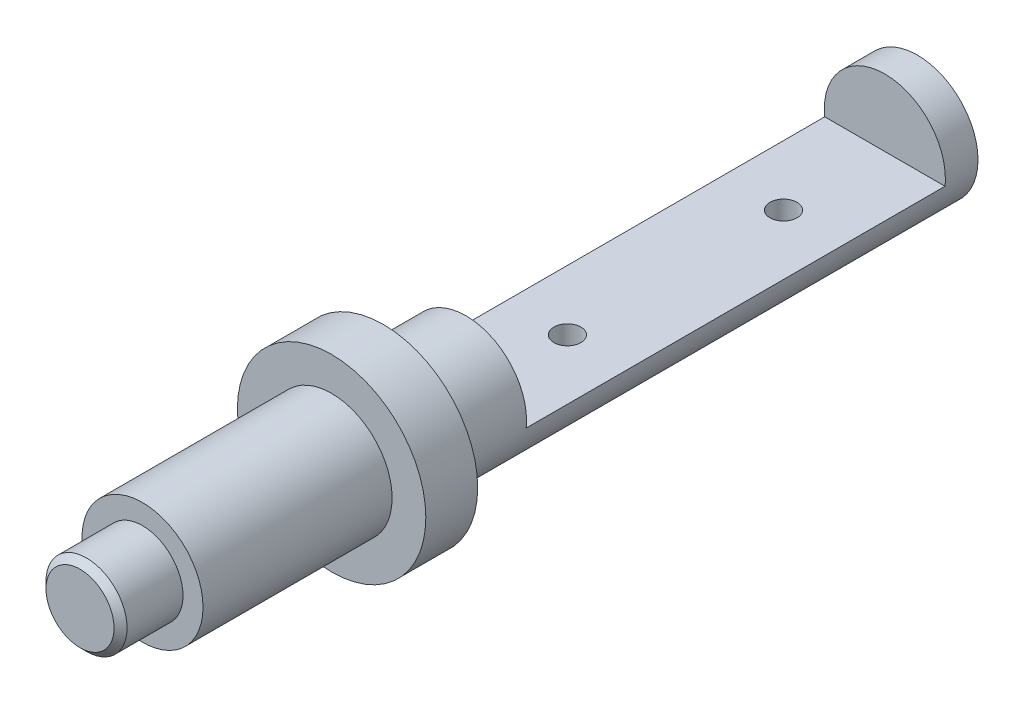
ISO-10303-21;
HEADER;
FILE_DESCRIPTION(('STEP AP214'),'2;1');
FILE_NAME('part.step','',(''),(''),'','','');
FILE_SCHEMA(('AUTOMOTIVE_DESIGN { 1 0 10303 214 1 1 1 1 }'));
ENDSEC;
DATA;
#1=APPLICATION_CONTEXT('core data for automotive mechanical design processes');
#2=APPLICATION_PROTOCOL_DEFINITION('international standard','automotive_design',2000,#1);
#3=PRODUCT_CONTEXT('',#1,'mechanical');
#4=PRODUCT('Part','Part','',(#3));
#5=PRODUCT_RELATED_PRODUCT_CATEGORY('part','',(#4));
#6=PRODUCT_DEFINITION_FORMATION('','',#4);
#7=PRODUCT_DEFINITION_CONTEXT('part definition',#1,'design');
#8=PRODUCT_DEFINITION('design','',#6,#7);
#9=PRODUCT_DEFINITION_SHAPE('','',#8);
#10=(LENGTH_UNIT() NAMED_UNIT(*) SI_UNIT(.MILLI.,.METRE.));
#11=(NAMED_UNIT(*) PLANE_ANGLE_UNIT() SI_UNIT($,.RADIAN.));
#12=(NAMED_UNIT(*) SI_UNIT($,.STERADIAN.) SOLID_ANGLE_UNIT());
#13=UNCERTAINTY_MEASURE_WITH_UNIT(LENGTH_MEASURE(1.E-05),#10,'distance_accuracy_value','');
#14=(GEOMETRIC_REPRESENTATION_CONTEXT(3) GLOBAL_UNCERTAINTY_ASSIGNED_CONTEXT((#13)) GLOBAL_UNIT_ASSIGNED_CONTEXT((#10,
#11,#12)) REPRESENTATION_CONTEXT('',''));
#15=CARTESIAN_POINT('',(0.,0.,0.));
#16=DIRECTION('',(0.,0.,1.));
#17=DIRECTION('',(1.,0.,0.));
#18=AXIS2_PLACEMENT_3D('',#15,#16,#17);
#19=CARTESIAN_POINT('',(5.55111512312578E-13,1.33226762955019E-12,-192.6));
#20=DIRECTION('',(0.,0.,1.));
#21=DIRECTION('',(1.00000000000001,0.,0.));
#22=AXIS2_PLACEMENT_3D('',#19,#20,#21);
#23=PLANE('',#22);
#24=CARTESIAN_POINT('',(5.55111512312578E-13,1.33226762955019E-12,-192.6));
#25=DIRECTION('',(0.,0.,1.));
#26=DIRECTION('',(1.00000000000001,0.,0.));
#27=AXIS2_PLACEMENT_3D('',#24,#25,#26);
#28=CIRCLE('',#27,28.);
#29=CARTESIAN_POINT('',(28.0000000000007,1.32915900508124E-12,-192.6));
#30=VERTEX_POINT('',#29);
#31=EDGE_CURVE('E601',#30,#30,#28,.T.);
#32=ORIENTED_EDGE('',*,*,#31,.F.);
#33=EDGE_LOOP('',(#32));
#34=FACE_BOUND('',#33,.T.);
#35=ADVANCED_FACE('F547',(#34),#23,.F.);
#36=CARTESIAN_POINT('',(7.7715611723761E-13,1.99840144432528E-12,76.3671457905544));
#37=DIRECTION('',(0.,0.,1.));
#38=DIRECTION('',(1.00000000000001,0.,0.));
#39=AXIS2_PLACEMENT_3D('',#36,#37,#38);
#40=CYLINDRICAL_SURFACE('',#39,28.);
#41=CARTESIAN_POINT('',(1.22124532708767E-12,-27.9999999999985,-24.3499999999999));
#42=CARTESIAN_POINT('',(0.173287733267454,-28.0000023074893,-24.3499958426639));
#43=CARTESIAN_POINT('',(0.346526436477157,-27.9983887060969,-24.3572084023678));
#44=CARTESIAN_POINT('',(0.691798529481551,-27.991984406191,-24.3859909947734));
#45=CARTESIAN_POINT('',(0.863831740794679,-27.9871932468583,-24.4075631099433));
#46=CARTESIAN_POINT('',(1.20546852164505,-27.9745615189492,-24.4649068683229));
#47=CARTESIAN_POINT('',(1.3750710244382,-27.9667196516067,-24.5006845593513));
#48=CARTESIAN_POINT('',(1.71063801646085,-27.9482014313855,-24.5861655729498));
#49=CARTESIAN_POINT('',(1.87660114262785,-27.937524035497,-24.6358740201285));
#50=CARTESIAN_POINT('',(2.20342803103323,-27.9136475008783,-24.7487393166743));
#51=CARTESIAN_POINT('',(2.36429886090368,-27.9004520535596,-24.8118764951322));
#52=CARTESIAN_POINT('',(2.68016000285815,-27.8718836943499,-24.9511905778944));
#53=CARTESIAN_POINT('',(2.8351481194758,-27.8565099794519,-25.0273722931678));
#54=CARTESIAN_POINT('',(3.13808852917903,-27.824011246058,-25.1921703418689));
#55=CARTESIAN_POINT('',(3.28604367387584,-27.8068869463878,-25.2807815770004));
#56=CARTESIAN_POINT('',(3.57407495168302,-27.7713351594833,-25.4698752643125));
#57=CARTESIAN_POINT('',(3.71414810525723,-27.7529071852996,-25.570362161797));
#58=CARTESIAN_POINT('',(3.98743275108861,-27.7149723161634,-25.7840470177098));
#59=CARTESIAN_POINT('',(4.12051440767463,-27.6954536070871,-25.8974089569195));
#60=CARTESIAN_POINT('',(4.37674315428471,-27.6561192154818,-26.1348970074828));
#61=CARTESIAN_POINT('',(4.49988654239949,-27.6363034255225,-26.2590270944711));
#62=CARTESIAN_POINT('',(4.73533123112035,-27.596936138365,-26.5171523543634));
#63=CARTESIAN_POINT('',(4.84763549399836,-27.5773845702198,-26.6511448141908));
#64=CARTESIAN_POINT('',(5.06071673810776,-27.539078996034,-26.9281888075165));
#65=CARTESIAN_POINT('',(5.16148945125865,-27.5203252869015,-27.0712436649679));
#66=CARTESIAN_POINT('',(5.35181850822265,-27.4839505199672,-27.3670731484463));
#67=CARTESIAN_POINT('',(5.44123634312828,-27.466344528521,-27.5199388093159));
#68=CARTESIAN_POINT('',(5.60688439498399,-27.4330090939004,-27.8329227310253));
#69=CARTESIAN_POINT('',(5.68310964700846,-27.4172803579046,-27.9930436938601));
#70=CARTESIAN_POINT('',(5.82171201998977,-27.3881854150516,-28.3193108154286));
#71=CARTESIAN_POINT('',(5.88409562345821,-27.3748181028603,-28.4854541111059));
#72=CARTESIAN_POINT('',(5.99457765259015,-27.350835124554,-28.8226156148095));
#73=CARTESIAN_POINT('',(6.04267092405303,-27.3402204514292,-28.9936355574174));
#74=CARTESIAN_POINT('',(6.16348147602606,-27.313341953062,-29.5065698393917));
#75=CARTESIAN_POINT('',(6.21514357018168,-27.301518241543,-29.8540652267514));
#76=CARTESIAN_POINT('',(6.24850925497434,-27.2938833534421,-30.3776751882252));
#77=CARTESIAN_POINT('',(6.25226931236133,-27.293023499729,-30.5526760856264));
#78=CARTESIAN_POINT('',(6.24512818546682,-27.2946587718555,-30.9023842614295));
#79=CARTESIAN_POINT('',(6.2342268106138,-27.2971539413041,-31.0770915359854));
#80=CARTESIAN_POINT('',(6.18026048197261,-27.3094493243984,-31.5921012538089));
#81=CARTESIAN_POINT('',(6.11636371447999,-27.3239631647007,-31.930342375705));
#82=CARTESIAN_POINT('',(5.93430755691003,-27.3640732042122,-32.5910010167121));
#83=CARTESIAN_POINT('',(5.81614500958046,-27.3896700482399,-32.9134176139239));
#84=CARTESIAN_POINT('',(5.52790655715205,-27.4492987065173,-33.5365824888621));
#85=CARTESIAN_POINT('',(5.35741003786184,-27.4833984266513,-33.8371298578225));
#86=CARTESIAN_POINT('',(4.96963966609209,-27.5561513937286,-34.4057420300863));
#87=CARTESIAN_POINT('',(4.75235918770855,-27.5948052853172,-34.673802223893));
#88=CARTESIAN_POINT('',(4.27137013352224,-27.6733802530283,-35.1761901463125));
#89=CARTESIAN_POINT('',(4.00672510942825,-27.7133102487908,-35.4096209206226));
#90=CARTESIAN_POINT('',(3.44158844330982,-27.789145780144,-35.8289360085532));
#91=CARTESIAN_POINT('',(3.14109609881205,-27.825051236842,-36.0148193901981));
#92=CARTESIAN_POINT('',(2.51167474315583,-27.8889163273921,-36.3340003831507));
#93=CARTESIAN_POINT('',(2.18268221225634,-27.9168575843351,-36.4671766464634));
#94=CARTESIAN_POINT('',(1.50622494940677,-27.9615100011358,-36.6761044758307));
#95=CARTESIAN_POINT('',(1.15876302613189,-27.9782228632743,-36.7518647466596));
#96=CARTESIAN_POINT('',(0.462921185445367,-27.9982917913791,-36.842496607642));
#97=CARTESIAN_POINT('',(0.114708330446478,-28.0019164988739,-36.8585930171177));
#98=CARTESIAN_POINT('',(-0.579431141153551,-27.9961551885639,-36.8327653042006));
#99=CARTESIAN_POINT('',(-0.92535791785761,-27.9867700917996,-36.7908452891321));
#100=CARTESIAN_POINT('',(-1.60102042690718,-27.9562136095172,-36.6511899831581));
#101=CARTESIAN_POINT('',(-1.93089639113403,-27.935178692576,-36.5541006220166));
#102=CARTESIAN_POINT('',(-2.56967883178033,-27.8836785395327,-36.3075811892587));
#103=CARTESIAN_POINT('',(-2.87858346875627,-27.8532124775028,-36.1581465333784));
#104=CARTESIAN_POINT('',(-3.47169220712458,-27.7855691492702,-35.8086554395884));
#105=CARTESIAN_POINT('',(-3.7554641912342,-27.7482994216908,-35.6078840515356));
#106=CARTESIAN_POINT('',(-4.28573159126958,-27.6713646917762,-35.1623390591317));
#107=CARTESIAN_POINT('',(-4.53222194260844,-27.631699365029,-34.9175594862816));
#108=CARTESIAN_POINT('',(-4.98578225781782,-27.5535125980924,-34.385380887178));
#109=CARTESIAN_POINT('',(-5.19200214503757,-27.5150278704193,-34.0972522144457));
#110=CARTESIAN_POINT('',(-5.55318005696257,-27.4444213582722,-33.4895356687433));
#111=CARTESIAN_POINT('',(-5.70814032737234,-27.412299295072,-33.1699491747493));
#112=CARTESIAN_POINT('',(-5.89809930930836,-27.3718192690609,-32.675107898303));
#113=CARTESIAN_POINT('',(-5.95425582185352,-27.3596295447533,-32.5079965477117));
#114=CARTESIAN_POINT('',(-6.0522924574854,-27.3381107961337,-32.1694735753886));
#115=CARTESIAN_POINT('',(-6.09417789279871,-27.3287807074889,-31.998063579337));
#116=CARTESIAN_POINT('',(-6.16332227927601,-27.3132698536923,-31.6521791705872));
#117=CARTESIAN_POINT('',(-6.19058040873366,-27.3070892654685,-31.4777045863005));
#118=CARTESIAN_POINT('',(-6.23024201169849,-27.2980677291016,-31.1269912529111));
#119=CARTESIAN_POINT('',(-6.24264609834655,-27.2952266431117,-30.9507525769289));
#120=CARTESIAN_POINT('',(-6.25238023667558,-27.2929984334103,-30.6018560940865));
#121=CARTESIAN_POINT('',(-6.25004688074713,-27.2935341846273,-30.4292080608417));
#122=CARTESIAN_POINT('',(-6.2311122311961,-27.2978631892454,-30.0847400297441));
#123=CARTESIAN_POINT('',(-6.21451122887052,-27.3016563761409,-29.9129200150579));
#124=CARTESIAN_POINT('',(-6.16717429747162,-27.3123881868259,-29.5713109072922));
#125=CARTESIAN_POINT('',(-6.13643606915819,-27.3193273222613,-29.4015221491811));
#126=CARTESIAN_POINT('',(-6.06108612830214,-27.336143147292,-29.0652650442606));
#127=CARTESIAN_POINT('',(-6.01647933554203,-27.3460187951246,-28.8987955422164));
#128=CARTESIAN_POINT('',(-5.91391695166157,-27.3683819096723,-28.5708365434456));
#129=CARTESIAN_POINT('',(-5.85600790038176,-27.3808602567895,-28.4093318595751));
#130=CARTESIAN_POINT('',(-5.72721655121593,-27.4080885495984,-28.0918479366903));
#131=CARTESIAN_POINT('',(-5.65633880183105,-27.422837698567,-27.935866783234));
#132=CARTESIAN_POINT('',(-5.50207735834808,-27.4542043948414,-27.6303291021149));
#133=CARTESIAN_POINT('',(-5.41868827052669,-27.4708227471963,-27.4807753813103));
#134=CARTESIAN_POINT('',(-5.24004005325601,-27.5054585978024,-27.1891778713593));
#135=CARTESIAN_POINT('',(-5.1447849181125,-27.5234756244714,-27.0471315778985));
#136=CARTESIAN_POINT('',(-4.94086270821219,-27.5608208365797,-26.7684439164268));
#137=CARTESIAN_POINT('',(-4.83195229564848,-27.5801688265765,-26.6319831981048));
#138=CARTESIAN_POINT('',(-4.60317572148867,-27.6192728309771,-26.3687266312023));
#139=CARTESIAN_POINT('',(-4.48331336764108,-27.6390287017343,-26.2419274514248));
#140=CARTESIAN_POINT('',(-4.23332522433012,-27.6784207302372,-25.9987080807794));
#141=CARTESIAN_POINT('',(-4.10319341611213,-27.6980568104036,-25.8822940629083));
#142=CARTESIAN_POINT('',(-3.83363825662289,-27.736649854321,-25.6607549171102));
#143=CARTESIAN_POINT('',(-3.6942183284844,-27.7556070643519,-25.5556256670808));
#144=CARTESIAN_POINT('',(-3.40494373096318,-27.7925873438712,-25.3559388832299));
#145=CARTESIAN_POINT('',(-3.2549699980811,-27.8105935516094,-25.2615505875388));
#146=CARTESIAN_POINT('',(-2.9474573026029,-27.8448634637038,-25.0858047770664));
#147=CARTESIAN_POINT('',(-2.78992115437861,-27.8611278091286,-25.0044424627576));
#148=CARTESIAN_POINT('',(-2.46840729727039,-27.8914504457932,-24.8553643327989));
#149=CARTESIAN_POINT('',(-2.30443306062898,-27.9055099062977,-24.7876412787092));
#150=CARTESIAN_POINT('',(-1.9711953230078,-27.931028327314,-24.6663380368702));
#151=CARTESIAN_POINT('',(-1.80193275162723,-27.9424877419761,-24.6127553789496));
#152=CARTESIAN_POINT('',(-1.36548835922026,-27.9679417662887,-24.494816696785));
#153=CARTESIAN_POINT('',(-1.09537664552741,-27.9798958519034,-24.4405929537996));
#154=CARTESIAN_POINT('',(-0.550135299285174,-27.9959229491062,-24.3681887670947));
#155=CARTESIAN_POINT('',(-0.275005907626351,-27.9999963380336,-24.3500065976507));
#156=CARTESIAN_POINT('',(1.22124532708767E-12,-27.9999999999985,-24.3499999999999));
#157=B_SPLINE_CURVE_WITH_KNOTS('',3,(#41,#42,#43,#44,#45,#46,#47,#48,#49,#50,#51,#52,#53,#54,
#55,#56,#57,#58,#59,#60,#61,#62,#63,#64,#65,#66,#67,#68,#69,#70,#71,#72,#73,#74,#75,#76,#77,#78,
#79,#80,#81,#82,#83,#84,#85,#86,#87,#88,#89,#90,#91,#92,#93,#94,#95,#96,#97,#98,#99,#100,#101,
#102,#103,#104,#105,#106,#107,#108,#109,#110,#111,#112,#113,#114,#115,#116,#117,#118,#119,#120,
#121,#122,#123,#124,#125,#126,#127,#128,#129,#130,#131,#132,#133,#134,#135,#136,#137,#138,#139,
#140,#141,#142,#143,#144,#145,#146,#147,#148,#149,#150,#151,#152,#153,#154,#155,#156),
.UNSPECIFIED.,.T.,.F.,(4,2,2,2,2,2,2,2,2,2,2,2,2,2,2,2,2,2,2,2,2,2,2,2,2,2,2,2,2,2,2,2,2,2,2,2,
2,2,2,2,2,2,2,2,2,2,2,2,2,2,2,2,2,2,2,2,2,4),(0.,0.519621355438907,1.0393180844373,
1.55923630446025,2.07934603473637,2.59869907232006,3.11824406723429,3.63757657681991,
4.15710410262553,4.6842071182335,5.21150557703352,5.73865951763503,6.26600794272164,
6.79927224394229,7.33273680067872,7.86595098810417,8.39935726107158,9.44774844022785,
9.97235964957142,10.4969776779571,11.5252983768442,12.5536789123211,13.5905512322937,
14.6275704988032,15.6879740503818,16.7483983853162,17.8112501352798,18.8739407152312,
19.9146908936496,20.9553673950011,21.9841034233225,23.0129295681858,24.0569484922633,
25.1011091157327,26.1653675706123,27.2295793937219,27.7591901243986,28.2886034983002,
28.8180466095165,29.3474678657799,29.8648419429633,30.3822054573719,30.8996531441506,
31.4169174787876,31.932398934955,32.4476999420747,32.963223740704,33.4785744721448,
34.0049506918968,34.5311445936043,35.0576492123285,35.5839608501359,36.1176653274796,
36.6511727022879,37.1843961909758,37.7175264696482,38.5421998754899,39.3668337937811),.UNSPECIFIED.);
#158=CARTESIAN_POINT('',(1.22124532708767E-12,-27.9999999999985,-24.3499999999999));
#159=VERTEX_POINT('',#158);
#160=EDGE_CURVE('E612',#159,#159,#157,.T.);
#161=ORIENTED_EDGE('',*,*,#160,.T.);
#162=EDGE_LOOP('',(#161));
#163=FACE_BOUND('',#162,.T.);
#164=CARTESIAN_POINT('',(5.55111512312578E-13,-27.9999999999978,-124.35));
#165=CARTESIAN_POINT('',(0.173287733266815,-28.0000023074887,-124.349995842664));
#166=CARTESIAN_POINT('',(0.346526436476538,-27.9983887060967,-124.357208402368));
#167=CARTESIAN_POINT('',(0.691798529480962,-27.9919844061911,-124.385990994773));
#168=CARTESIAN_POINT('',(0.8638317407941,-27.9871932468583,-124.407563109943));
#169=CARTESIAN_POINT('',(1.20546852164451,-27.9745615189493,-124.464906868323));
#170=CARTESIAN_POINT('',(1.37507102443769,-27.9667196516069,-124.500684559351));
#171=CARTESIAN_POINT('',(1.71063801646038,-27.9482014313854,-124.58616557295));
#172=CARTESIAN_POINT('',(1.87660114262738,-27.9375240354963,-124.635874020129));
#173=CARTESIAN_POINT('',(2.20342803103276,-27.9136475008776,-124.748739316674));
#174=CARTESIAN_POINT('',(2.3642988609032,-27.9004520535595,-124.811876495132));
#175=CARTESIAN_POINT('',(2.68016000285763,-27.8718836943501,-124.951190577895));
#176=CARTESIAN_POINT('',(2.83514811947526,-27.856509979452,-125.027372293168));
#177=CARTESIAN_POINT('',(3.13808852917843,-27.824011246058,-125.192170341869));
#178=CARTESIAN_POINT('',(3.28604367387521,-27.806886946388,-125.280781577001));
#179=CARTESIAN_POINT('',(3.57407495168237,-27.7713351594833,-125.469875264313));
#180=CARTESIAN_POINT('',(3.71414810525659,-27.7529071852992,-125.570362161797));
#181=CARTESIAN_POINT('',(3.98743275108796,-27.714972316163,-125.78404701771));
#182=CARTESIAN_POINT('',(4.12051440767394,-27.695453607087,-125.89740895692));
#183=CARTESIAN_POINT('',(4.37674315428404,-27.6561192154821,-126.134897007483));
#184=CARTESIAN_POINT('',(4.49988654239889,-27.6363034255225,-126.259027094471));
#185=CARTESIAN_POINT('',(4.73533123111974,-27.5969361383651,-126.517152354364));
#186=CARTESIAN_POINT('',(4.84763549399768,-27.5773845702202,-126.651144814191));
#187=CARTESIAN_POINT('',(5.06071673810734,-27.5390789960339,-126.928188807517));
#188=CARTESIAN_POINT('',(5.16148945125854,-27.5203252869006,-127.071243664968));
#189=CARTESIAN_POINT('',(5.35181850822251,-27.4839505199663,-127.367073148446));
#190=CARTESIAN_POINT('',(5.44123634312779,-27.4663445285209,-127.519938809316));
#191=CARTESIAN_POINT('',(5.60688439498328,-27.4330090939007,-127.832922731026));
#192=CARTESIAN_POINT('',(5.68310964700787,-27.4172803579047,-127.99304369386));
#193=CARTESIAN_POINT('',(5.82171201998915,-27.3881854150518,-128.319310815429));
#194=CARTESIAN_POINT('',(5.88409562345744,-27.3748181028609,-128.485454111106));
#195=CARTESIAN_POINT('',(5.99457765258971,-27.3508351245538,-128.82261561481));
#196=CARTESIAN_POINT('',(6.04267092405309,-27.3402204514278,-128.993635557417));
#197=CARTESIAN_POINT('',(6.16348147602661,-27.3133419530595,-129.506569839391));
#198=CARTESIAN_POINT('',(6.21514357018127,-27.3015182415427,-129.854065226751));
#199=CARTESIAN_POINT('',(6.24850925497355,-27.2938833534425,-130.377675188225));
#200=CARTESIAN_POINT('',(6.25226931236059,-27.2930234997293,-130.552676085626));
#201=CARTESIAN_POINT('',(6.24512818546624,-27.2946587718556,-130.90238426143));
#202=CARTESIAN_POINT('',(6.23422681061332,-27.2971539413042,-131.077091535985));
#203=CARTESIAN_POINT('',(6.18026048197223,-27.3094493243983,-131.592101253809));
#204=CARTESIAN_POINT('',(6.11636371447937,-27.3239631647005,-131.930342375705));
#205=CARTESIAN_POINT('',(5.93430755690938,-27.3640732042127,-132.591001016712));
#206=CARTESIAN_POINT('',(5.81614500958003,-27.3896700482411,-132.913417613924));
#207=CARTESIAN_POINT('',(5.52790655715161,-27.4492987065183,-133.536582488862));
#208=CARTESIAN_POINT('',(5.35741003786118,-27.4833984266513,-133.837129857822));
#209=CARTESIAN_POINT('',(4.96963966609193,-27.5561513937287,-134.405742030086));
#210=CARTESIAN_POINT('',(4.7523591877091,-27.5948052853183,-134.673802223893));
#211=CARTESIAN_POINT('',(4.27137013352299,-27.6733802530294,-135.176190146313));
#212=CARTESIAN_POINT('',(4.00672510942845,-27.7133102487909,-135.409620920622));
#213=CARTESIAN_POINT('',(3.44158844330996,-27.7891457801438,-135.828936008553));
#214=CARTESIAN_POINT('',(3.14109609881268,-27.8250512368425,-136.014819390198));
#215=CARTESIAN_POINT('',(2.51167474315667,-27.8889163273929,-136.334000383151));
#216=CARTESIAN_POINT('',(2.18268221225689,-27.9168575843354,-136.467176646463));
#217=CARTESIAN_POINT('',(1.50622494940703,-27.9615100011355,-136.67610447583));
#218=CARTESIAN_POINT('',(1.15876302613215,-27.9782228632737,-136.751864746659));
#219=CARTESIAN_POINT('',(0.462921185445655,-27.9982917913788,-136.842496607642));
#220=CARTESIAN_POINT('',(0.114708330446787,-28.001916498874,-136.858593017118));
#221=CARTESIAN_POINT('',(-0.579431141153051,-27.9961551885638,-136.832765304201));
#222=CARTESIAN_POINT('',(-0.925357917856941,-27.9867700917988,-136.790845289132));
#223=CARTESIAN_POINT('',(-1.60102042690659,-27.9562136095166,-136.651189983158));
#224=CARTESIAN_POINT('',(-1.93089639113367,-27.9351786925762,-136.554100622017));
#225=CARTESIAN_POINT('',(-2.56967883177983,-27.8836785395326,-136.307581189259));
#226=CARTESIAN_POINT('',(-2.8785834687554,-27.8532124775016,-136.158146533378));
#227=CARTESIAN_POINT('',(-3.47169220712394,-27.7855691492687,-135.808655439588));
#228=CARTESIAN_POINT('',(-3.75546419123417,-27.7482994216902,-135.607884051536));
#229=CARTESIAN_POINT('',(-4.28573159126994,-27.6713646917767,-135.162339059132));
#230=CARTESIAN_POINT('',(-4.53222194260857,-27.6316993650297,-134.917559486282));
#231=CARTESIAN_POINT('',(-4.98578225781809,-27.553512598093,-134.385380887178));
#232=CARTESIAN_POINT('',(-5.19200214503823,-27.5150278704197,-134.097252214446));
#233=CARTESIAN_POINT('',(-5.55318005696296,-27.4444213582716,-133.489535668744));
#234=CARTESIAN_POINT('',(-5.70814032737207,-27.4122992950705,-133.169949174749));
#235=CARTESIAN_POINT('',(-5.89809930930849,-27.37181926906,-132.675107898303));
#236=CARTESIAN_POINT('',(-5.95425582185402,-27.359629544753,-132.507996547712));
#237=CARTESIAN_POINT('',(-6.05229245748616,-27.3381107961337,-132.169473575389));
#238=CARTESIAN_POINT('',(-6.09417789279937,-27.3287807074888,-131.998063579337));
#239=CARTESIAN_POINT('',(-6.16332227927665,-27.3132698536922,-131.652179170587));
#240=CARTESIAN_POINT('',(-6.19058040873437,-27.3070892654684,-131.477704586301));
#241=CARTESIAN_POINT('',(-6.2302420116991,-27.2980677291014,-131.126991252911));
#242=CARTESIAN_POINT('',(-6.242646098347,-27.2952266431111,-130.950752576929));
#243=CARTESIAN_POINT('',(-6.25238023667602,-27.2929984334097,-130.601856094087));
#244=CARTESIAN_POINT('',(-6.25004688074772,-27.293534184627,-130.429208060842));
#245=CARTESIAN_POINT('',(-6.23111223119683,-27.2978631892454,-130.084740029744));
#246=CARTESIAN_POINT('',(-6.21451122887122,-27.3016563761408,-129.912920015058));
#247=CARTESIAN_POINT('',(-6.16717429747221,-27.3123881868257,-129.571310907292));
#248=CARTESIAN_POINT('',(-6.13643606915869,-27.3193273222612,-129.401522149181));
#249=CARTESIAN_POINT('',(-6.0610861283029,-27.3361431472918,-129.06526504426));
#250=CARTESIAN_POINT('',(-6.01647933554313,-27.3460187951244,-128.898795542216));
#251=CARTESIAN_POINT('',(-5.91391695166267,-27.3683819096721,-128.570836543445));
#252=CARTESIAN_POINT('',(-5.85600790038252,-27.3808602567894,-128.409331859575));
#253=CARTESIAN_POINT('',(-5.7272165512164,-27.4080885495983,-128.09184793669));
#254=CARTESIAN_POINT('',(-5.65633880183155,-27.4228376985668,-127.935866783234));
#255=CARTESIAN_POINT('',(-5.50207735834868,-27.4542043948414,-127.630329102115));
#256=CARTESIAN_POINT('',(-5.41868827052735,-27.4708227471965,-127.48077538131));
#257=CARTESIAN_POINT('',(-5.24004005325619,-27.5054585978021,-127.189177871359));
#258=CARTESIAN_POINT('',(-5.14478491811213,-27.5234756244705,-127.047131577898));
#259=CARTESIAN_POINT('',(-4.94086270821174,-27.5608208365788,-126.768443916427));
#260=CARTESIAN_POINT('',(-4.83195229564853,-27.5801688265763,-126.631983198104));
#261=CARTESIAN_POINT('',(-4.60317572148912,-27.6192728309772,-126.368726631202));
#262=CARTESIAN_POINT('',(-4.48331336764144,-27.6390287017343,-126.241927451425));
#263=CARTESIAN_POINT('',(-4.23332522433045,-27.6784207302371,-125.998708080779));
#264=CARTESIAN_POINT('',(-4.10319341611254,-27.6980568104037,-125.882294062908));
#265=CARTESIAN_POINT('',(-3.83363825662354,-27.7366498543207,-125.66075491711));
#266=CARTESIAN_POINT('',(-3.69421832848521,-27.7556070643512,-125.555625667081));
#267=CARTESIAN_POINT('',(-3.40494373096404,-27.7925873438705,-125.35593888323));
#268=CARTESIAN_POINT('',(-3.25496999808185,-27.8105935516092,-125.261550587539));
#269=CARTESIAN_POINT('',(-2.94745730260352,-27.8448634637039,-125.085804777067));
#270=CARTESIAN_POINT('',(-2.7899211543792,-27.8611278091285,-125.004442462758));
#271=CARTESIAN_POINT('',(-2.46840729727091,-27.8914504457932,-124.855364332799));
#272=CARTESIAN_POINT('',(-2.30443306062945,-27.9055099062979,-124.787641278709));
#273=CARTESIAN_POINT('',(-1.97119532300806,-27.9310283273137,-124.66633803687));
#274=CARTESIAN_POINT('',(-1.80193275162733,-27.942487741975,-124.61275537895));
#275=CARTESIAN_POINT('',(-1.3654883592203,-27.9679417662871,-124.494816696785));
#276=CARTESIAN_POINT('',(-1.09537664552763,-27.9798958519032,-124.4405929538));
#277=CARTESIAN_POINT('',(-0.550135299285652,-27.9959229491064,-124.368188767095));
#278=CARTESIAN_POINT('',(-0.275005907626914,-27.9999963380328,-124.350006597651));
#279=CARTESIAN_POINT('',(5.55111512312578E-13,-27.9999999999978,-124.35));
#280=B_SPLINE_CURVE_WITH_KNOTS('',3,(#164,#165,#166,#167,#168,#169,#170,#171,#172,#173,#174,
#175,#176,#177,#178,#179,#180,#181,#182,#183,#184,#185,#186,#187,#188,#189,#190,#191,#192,#193,
#194,#195,#196,#197,#198,#199,#200,#201,#202,#203,#204,#205,#206,#207,#208,#209,#210,#211,#212,
#213,#214,#215,#216,#217,#218,#219,#220,#221,#222,#223,#224,#225,#226,#227,#228,#229,#230,#231,
#232,#233,#234,#235,#236,#237,#238,#239,#240,#241,#242,#243,#244,#245,#246,#247,#248,#249,#250,
#251,#252,#253,#254,#255,#256,#257,#258,#259,#260,#261,#262,#263,#264,#265,#266,#267,#268,#269,
#270,#271,#272,#273,#274,#275,#276,#277,#278,#279),.UNSPECIFIED.,.T.,.F.,(4,2,2,2,2,2,2,2,2,2,2,
2,2,2,2,2,2,2,2,2,2,2,2,2,2,2,2,2,2,2,2,2,2,2,2,2,2,2,2,2,2,2,2,2,2,2,2,2,2,2,2,2,2,2,2,2,2,4),
(0.,0.519621355438966,1.0393180844374,1.55923630446042,2.07934603473662,2.59869907232023,
3.11824406723439,3.63757657681993,4.15710410262544,4.68420711823346,5.2115055770336,
5.73865951763524,6.26600794272188,6.79927224394244,7.33273680067897,7.86595098810441,
8.39935726107176,9.44774844022804,9.97235964957165,10.4969776779573,11.5252983768443,
12.5536789123211,13.5905512322935,14.6275704988027,15.6879740503812,16.7483983853154,
17.8112501352792,18.8739407152308,19.914690893649,20.9553673950003,21.9841034233217,
23.0129295681851,24.0569484922629,25.1011091157325,26.1653675706122,27.2295793937218,
27.7591901243986,28.2886034983002,28.8180466095166,29.34746786578,29.8648419429635,
30.3822054573721,30.8996531441509,31.4169174787877,31.9323989349552,32.4476999420751,
32.9632237407046,33.4785744721456,34.0049506918975,34.5311445936049,35.0576492123288,
35.5839608501359,36.1176653274796,36.6511727022881,37.1843961909762,37.7175264696489,
38.5421998754902,39.3668337937812),.UNSPECIFIED.);
#281=CARTESIAN_POINT('',(5.55111512312578E-13,-27.9999999999978,-124.35));
#282=VERTEX_POINT('',#281);
#283=EDGE_CURVE('E606',#282,#282,#280,.T.);
#284=ORIENTED_EDGE('',*,*,#283,.T.);
#285=EDGE_LOOP('',(#284));
#286=FACE_BOUND('',#285,.T.);
#287=CARTESIAN_POINT('',(1.11022302462516E-13,1.33226762955019E-12,-177.5));
#288=DIRECTION('',(0.,0.,-1.));
#289=DIRECTION('',(-1.00000000000001,0.,0.));
#290=AXIS2_PLACEMENT_3D('',#287,#288,#289);
#291=CIRCLE('',#290,28.);
#292=CARTESIAN_POINT('',(-27.8278637340347,-3.09999999999921,-177.5));
#293=VERTEX_POINT('',#292);
#294=CARTESIAN_POINT('',(27.827863734034,-3.09999999999988,-177.500000000003));
#295=VERTEX_POINT('',#294);
#296=EDGE_CURVE('E590',#293,#295,#291,.T.);
#297=ORIENTED_EDGE('',*,*,#296,.T.);
#298=DIRECTION('',(0.,0.,1.));
#299=VECTOR('',#298,1.);
#300=CARTESIAN_POINT('',(27.8278637340347,-3.09999999999988,76.3671457905519));
#301=LINE('',#300,#299);
#302=CARTESIAN_POINT('',(27.8278637340352,-3.09999999999988,16.2999999999975));
#303=VERTEX_POINT('',#302);
#304=EDGE_CURVE('E578',#295,#303,#301,.T.);
#305=ORIENTED_EDGE('',*,*,#304,.T.);
#306=CARTESIAN_POINT('',(1.11022302462516E-12,1.11022302462516E-12,16.3));
#307=DIRECTION('',(0.,0.,-1.));
#308=DIRECTION('',(-1.00000000000001,0.,0.));
#309=AXIS2_PLACEMENT_3D('',#306,#307,#308);
#310=CIRCLE('',#309,28.);
#311=CARTESIAN_POINT('',(-27.8278637340341,-3.0999999999981,16.3));
#312=VERTEX_POINT('',#311);
#313=EDGE_CURVE('E574',#312,#303,#310,.T.);
#314=ORIENTED_EDGE('',*,*,#313,.F.);
#315=DIRECTION('',(0.,0.,1.));
#316=VECTOR('',#315,1.);
#317=CARTESIAN_POINT('',(-27.8278637340343,-3.09999999999855,76.3671457905544));
#318=LINE('',#317,#316);
#319=EDGE_CURVE('E592',#312,#293,#318,.F.);
#320=ORIENTED_EDGE('',*,*,#319,.T.);
#321=EDGE_LOOP('',(#297,#305,#314,#320));
#322=FACE_BOUND('',#321,.T.);
#323=CARTESIAN_POINT('',(0.,0.,54.5));
#324=DIRECTION('',(0.,0.,1.));
#325=DIRECTION('',(1.00000000000001,0.,0.));
#326=AXIS2_PLACEMENT_3D('',#323,#324,#325);
#327=CIRCLE('',#326,28.);
#328=CARTESIAN_POINT('',(28.0000000000002,0.,54.5));
#329=VERTEX_POINT('',#328);
#330=EDGE_CURVE('E702',#329,#329,#327,.T.);
#331=ORIENTED_EDGE('',*,*,#330,.F.);
#332=EDGE_LOOP('',(#331));
#333=FACE_BOUND('',#332,.T.);
#334=ORIENTED_EDGE('',*,*,#31,.T.);
#335=EDGE_LOOP('',(#334));
#336=FACE_BOUND('',#335,.T.);
#337=ADVANCED_FACE('F595',(#163,#286,#322,#333,#336),#40,.T.);
#338=CARTESIAN_POINT('',(4.44089209850063E-13,28.0000000000027,54.5));
#339=DIRECTION('',(0.,0.,1.));
#340=DIRECTION('',(1.00000000000001,0.,0.));
#341=AXIS2_PLACEMENT_3D('',#338,#339,#340);
#342=PLANE('',#341);
#343=CARTESIAN_POINT('',(0.,0.,54.5));
#344=DIRECTION('',(0.,0.,1.));
#345=DIRECTION('',(1.00000000000001,0.,0.));
#346=AXIS2_PLACEMENT_3D('',#343,#344,#345);
#347=CIRCLE('',#346,43.6);
#348=CARTESIAN_POINT('',(43.6000000000003,0.,54.5));
#349=VERTEX_POINT('',#348);
#350=EDGE_CURVE('E705',#349,#349,#347,.T.);
#351=ORIENTED_EDGE('',*,*,#350,.F.);
#352=EDGE_LOOP('',(#351));
#353=FACE_BOUND('',#352,.T.);
#354=ORIENTED_EDGE('',*,*,#330,.T.);
#355=EDGE_LOOP('',(#354));
#356=FACE_BOUND('',#355,.T.);
#357=ADVANCED_FACE('F636',(#353,#356),#342,.F.);
#358=CARTESIAN_POINT('',(7.7715611723761E-13,1.99840144432528E-12,76.3671457905544));
#359=DIRECTION('',(0.,0.,1.));
#360=DIRECTION('',(1.00000000000001,0.,0.));
#361=AXIS2_PLACEMENT_3D('',#358,#359,#360);
#362=CYLINDRICAL_SURFACE('',#361,43.6);
#363=CARTESIAN_POINT('',(7.7715611723761E-13,1.99840144432528E-12,78.5));
#364=DIRECTION('',(0.,0.,1.));
#365=DIRECTION('',(1.00000000000001,0.,0.));
#366=AXIS2_PLACEMENT_3D('',#363,#364,#365);
#367=CIRCLE('',#366,43.6);
#368=CARTESIAN_POINT('',(43.6000000000011,1.99356087193792E-12,78.5));
#369=VERTEX_POINT('',#368);
#370=EDGE_CURVE('E699',#369,#369,#367,.T.);
#371=ORIENTED_EDGE('',*,*,#370,.F.);
#372=EDGE_LOOP('',(#371));
#373=FACE_BOUND('',#372,.T.);
#374=ORIENTED_EDGE('',*,*,#350,.T.);
#375=EDGE_LOOP('',(#374));
#376=FACE_BOUND('',#375,.T.);
#377=ADVANCED_FACE('F690',(#373,#376),#362,.T.);
#378=CARTESIAN_POINT('',(-1.11022302462516E-13,43.6000000000032,78.5));
#379=DIRECTION('',(0.,0.,-1.));
#380=DIRECTION('',(-1.00000000000001,0.,0.));
#381=AXIS2_PLACEMENT_3D('',#378,#379,#380);
#382=PLANE('',#381);
#383=CARTESIAN_POINT('',(7.7715611723761E-13,1.99840144432528E-12,78.5));
#384=DIRECTION('',(0.,0.,1.));
#385=DIRECTION('',(1.00000000000001,0.,0.));
#386=AXIS2_PLACEMENT_3D('',#383,#384,#385);
#387=CIRCLE('',#386,28.);
#388=CARTESIAN_POINT('',(28.000000000001,1.99529281985633E-12,78.5));
#389=VERTEX_POINT('',#388);
#390=EDGE_CURVE('E711',#389,#389,#387,.T.);
#391=ORIENTED_EDGE('',*,*,#390,.F.);
#392=EDGE_LOOP('',(#391));
#393=FACE_BOUND('',#392,.T.);
#394=ORIENTED_EDGE('',*,*,#370,.T.);
#395=EDGE_LOOP('',(#394));
#396=FACE_BOUND('',#395,.T.);
#397=ADVANCED_FACE('F685',(#393,#396),#382,.F.);
#398=CARTESIAN_POINT('',(7.7715611723761E-13,1.99840144432528E-12,76.3671457905544));
#399=DIRECTION('',(0.,0.,1.));
#400=DIRECTION('',(1.00000000000001,0.,0.));
#401=AXIS2_PLACEMENT_3D('',#398,#399,#400);
#402=CYLINDRICAL_SURFACE('',#401,28.);
#403=CARTESIAN_POINT('',(1.11022302462516E-13,0.,166.));
#404=DIRECTION('',(0.,0.,1.));
#405=DIRECTION('',(1.00000000000001,0.,0.));
#406=AXIS2_PLACEMENT_3D('',#403,#404,#405);
#407=CIRCLE('',#406,28.);
#408=CARTESIAN_POINT('',(28.0000000000003,0.,166.));
#409=VERTEX_POINT('',#408);
#410=EDGE_CURVE('E722',#409,#409,#407,.T.);
#411=ORIENTED_EDGE('',*,*,#410,.F.);
#412=EDGE_LOOP('',(#411));
#413=FACE_BOUND('',#412,.T.);
#414=ORIENTED_EDGE('',*,*,#390,.T.);
#415=EDGE_LOOP('',(#414));
#416=FACE_BOUND('',#415,.T.);
#417=ADVANCED_FACE('F678',(#413,#416),#402,.T.);
#418=CARTESIAN_POINT('',(3.33066907387547E-13,28.0000000000027,166.));
#419=DIRECTION('',(0.,0.,-1.));
#420=DIRECTION('',(-1.00000000000001,0.,0.));
#421=AXIS2_PLACEMENT_3D('',#418,#419,#420);
#422=PLANE('',#421);
#423=CARTESIAN_POINT('',(1.11022302462516E-13,0.,166.));
#424=DIRECTION('',(0.,0.,1.));
#425=DIRECTION('',(1.00000000000001,0.,0.));
#426=AXIS2_PLACEMENT_3D('',#423,#424,#425);
#427=CIRCLE('',#426,18.75);
#428=CARTESIAN_POINT('',(18.7500000000003,0.,166.));
#429=VERTEX_POINT('',#428);
#430=EDGE_CURVE('E587',#429,#429,#427,.T.);
#431=ORIENTED_EDGE('',*,*,#430,.F.);
#432=EDGE_LOOP('',(#431));
#433=FACE_BOUND('',#432,.T.);
#434=ORIENTED_EDGE('',*,*,#410,.T.);
#435=EDGE_LOOP('',(#434));
#436=FACE_BOUND('',#435,.T.);
#437=ADVANCED_FACE('F677',(#433,#436),#422,.F.);
#438=CARTESIAN_POINT('',(7.7715611723761E-13,1.99840144432528E-12,76.3671457905544));
#439=DIRECTION('',(0.,0.,1.));
#440=DIRECTION('',(1.00000000000001,0.,0.));
#441=AXIS2_PLACEMENT_3D('',#438,#439,#440);
#442=CYLINDRICAL_SURFACE('',#441,18.75);
#443=CARTESIAN_POINT('',(0.,0.,191.9));
#444=DIRECTION('',(0.,0.,-1.));
#445=DIRECTION('',(-1.00000000000001,0.,0.));
#446=AXIS2_PLACEMENT_3D('',#443,#444,#445);
#447=CIRCLE('',#446,18.75);
#448=CARTESIAN_POINT('',(-18.7500000000002,0.,191.9));
#449=VERTEX_POINT('',#448);
#450=EDGE_CURVE('E12',#449,#449,#447,.T.);
#451=ORIENTED_EDGE('',*,*,#450,.T.);
#452=EDGE_LOOP('',(#451));
#453=FACE_BOUND('',#452,.T.);
#454=ORIENTED_EDGE('',*,*,#430,.T.);
#455=EDGE_LOOP('',(#454));
#456=FACE_BOUND('',#455,.T.);
#457=ADVANCED_FACE('F673',(#453,#456),#442,.T.);
#458=CARTESIAN_POINT('',(2.22044604925031E-13,18.7500000000025,194.9));
#459=DIRECTION('',(0.,0.,-1.));
#460=DIRECTION('',(-1.00000000000001,0.,0.));
#461=AXIS2_PLACEMENT_3D('',#458,#459,#460);
#462=PLANE('',#461);
#463=CARTESIAN_POINT('',(0.,0.,194.9));
#464=DIRECTION('',(0.,0.,-1.));
#465=DIRECTION('',(-1.00000000000001,0.,0.));
#466=AXIS2_PLACEMENT_3D('',#463,#464,#465);
#467=CIRCLE('',#466,15.7499999999999);
#468=CARTESIAN_POINT('',(-15.75,0.,194.9));
#469=VERTEX_POINT('',#468);
#470=EDGE_CURVE('E557',#469,#469,#467,.F.);
#471=ORIENTED_EDGE('',*,*,#470,.T.);
#472=EDGE_LOOP('',(#471));
#473=FACE_BOUND('',#472,.T.);
#474=ADVANCED_FACE('F617',(#473),#462,.F.);
#475=CARTESIAN_POINT('',(-43.6000000000005,-3.0999999999981,16.3));
#476=DIRECTION('',(0.,0.,-1.));
#477=DIRECTION('',(-1.00000000000001,0.,0.));
#478=AXIS2_PLACEMENT_3D('',#475,#476,#477);
#479=PLANE('',#478);
#480=ORIENTED_EDGE('',*,*,#313,.T.);
#481=DIRECTION('',(1.00000000000001,0.,0.));
#482=VECTOR('',#481,1.);
#483=CARTESIAN_POINT('',(-43.6000000000005,-3.0999999999981,16.3));
#484=LINE('',#483,#482);
#485=EDGE_CURVE('E579',#312,#303,#484,.T.);
#486=ORIENTED_EDGE('',*,*,#485,.F.);
#487=EDGE_LOOP('',(#480,#486));
#488=FACE_BOUND('',#487,.T.);
#489=ADVANCED_FACE('F667',(#488),#479,.T.);
#490=CARTESIAN_POINT('',(-43.6000000000012,-3.09999999999877,-177.5));
#491=DIRECTION('',(0.,0.,-1.));
#492=DIRECTION('',(-1.00000000000001,0.,0.));
#493=AXIS2_PLACEMENT_3D('',#490,#491,#492);
#494=PLANE('',#493);
#495=DIRECTION('',(1.00000000000001,0.,0.));
#496=VECTOR('',#495,1.);
#497=CARTESIAN_POINT('',(-43.6000000000012,-3.09999999999877,-177.5));
#498=LINE('',#497,#496);
#499=EDGE_CURVE('E564',#293,#295,#498,.T.);
#500=ORIENTED_EDGE('',*,*,#499,.T.);
#501=ORIENTED_EDGE('',*,*,#296,.F.);
#502=EDGE_LOOP('',(#500,#501));
#503=FACE_BOUND('',#502,.T.);
#504=ADVANCED_FACE('F588',(#503),#494,.F.);
#505=CARTESIAN_POINT('',(-43.6000000000005,-3.0999999999981,16.3));
#506=DIRECTION('',(0.,-1.00000000000001,0.));
#507=DIRECTION('',(0.,0.,-1.));
#508=AXIS2_PLACEMENT_3D('',#505,#506,#507);
#509=PLANE('',#508);
#510=CARTESIAN_POINT('',(-2.22044604925031E-13,-3.09999999999899,-30.6));
#511=DIRECTION('',(0.,-1.00000000000001,0.));
#512=DIRECTION('',(0.,0.,-1.));
#513=AXIS2_PLACEMENT_3D('',#510,#511,#512);
#514=CIRCLE('',#513,6.25);
#515=CARTESIAN_POINT('',(-2.22044604925032E-13,-3.09999999999899,-36.85));
#516=VERTEX_POINT('',#515);
#517=EDGE_CURVE('E608',#516,#516,#514,.T.);
#518=ORIENTED_EDGE('',*,*,#517,.T.);
#519=EDGE_LOOP('',(#518));
#520=FACE_BOUND('',#519,.T.);
#521=CARTESIAN_POINT('',(-1.11022302462516E-12,-3.09999999999855,-130.6));
#522=DIRECTION('',(0.,-1.00000000000001,0.));
#523=DIRECTION('',(0.,0.,-1.));
#524=AXIS2_PLACEMENT_3D('',#521,#522,#523);
#525=CIRCLE('',#524,6.25);
#526=CARTESIAN_POINT('',(-1.11022302462516E-12,-3.09999999999855,-136.85));
#527=VERTEX_POINT('',#526);
#528=EDGE_CURVE('E604',#527,#527,#525,.T.);
#529=ORIENTED_EDGE('',*,*,#528,.T.);
#530=EDGE_LOOP('',(#529));
#531=FACE_BOUND('',#530,.T.);
#532=ORIENTED_EDGE('',*,*,#499,.F.);
#533=ORIENTED_EDGE('',*,*,#319,.F.);
#534=ORIENTED_EDGE('',*,*,#485,.T.);
#535=ORIENTED_EDGE('',*,*,#304,.F.);
#536=EDGE_LOOP('',(#532,#533,#534,#535));
#537=FACE_BOUND('',#536,.T.);
#538=ADVANCED_FACE('F577',(#520,#531,#537),#509,.F.);
#539=CARTESIAN_POINT('',(-6.66133814775094E-13,-43.5999999999988,-130.600000000001));
#540=DIRECTION('',(0.,1.00000000000001,0.));
#541=DIRECTION('',(0.,0.,1.));
#542=AXIS2_PLACEMENT_3D('',#539,#540,#541);
#543=CYLINDRICAL_SURFACE('',#542,6.25);
#544=ORIENTED_EDGE('',*,*,#528,.F.);
#545=EDGE_LOOP('',(#544));
#546=FACE_BOUND('',#545,.T.);
#547=ORIENTED_EDGE('',*,*,#283,.F.);
#548=EDGE_LOOP('',(#547));
#549=FACE_BOUND('',#548,.T.);
#550=ADVANCED_FACE('F627',(#546,#549),#543,.F.);
#551=CARTESIAN_POINT('',(0.,-43.5999999999994,-30.6000000000013));
#552=DIRECTION('',(0.,1.00000000000001,0.));
#553=DIRECTION('',(0.,0.,1.));
#554=AXIS2_PLACEMENT_3D('',#551,#552,#553);
#555=CYLINDRICAL_SURFACE('',#554,6.25);
#556=ORIENTED_EDGE('',*,*,#517,.F.);
#557=EDGE_LOOP('',(#556));
#558=FACE_BOUND('',#557,.T.);
#559=ORIENTED_EDGE('',*,*,#160,.F.);
#560=EDGE_LOOP('',(#559));
#561=FACE_BOUND('',#560,.T.);
#562=ADVANCED_FACE('F625',(#558,#561),#555,.F.);
#563=CARTESIAN_POINT('',(0.,0.,194.9));
#564=DIRECTION('',(0.,0.,-1.));
#565=DIRECTION('',(-1.00000000000001,0.,0.));
#566=AXIS2_PLACEMENT_3D('',#563,#564,#565);
#567=CONICAL_SURFACE('',#566,15.7499999999999,0.785398163397445);
#568=ORIENTED_EDGE('',*,*,#450,.F.);
#569=EDGE_LOOP('',(#568));
#570=FACE_BOUND('',#569,.T.);
#571=ORIENTED_EDGE('',*,*,#470,.F.);
#572=EDGE_LOOP('',(#571));
#573=FACE_BOUND('',#572,.T.);
#574=ADVANCED_FACE('F552',(#570,#573),#567,.T.);
#575=CLOSED_SHELL('',(#35,#337,#357,#377,#397,#417,#437,#457,#474,#489,#504,#538,#550,#562,#574));
#576=MANIFOLD_SOLID_BREP('B2',#575);
#577=ADVANCED_BREP_SHAPE_REPRESENTATION('',(#18,#576),#14);
#578=SHAPE_DEFINITION_REPRESENTATION(#9,#577);
ENDSEC;
END-ISO-10303-21;
